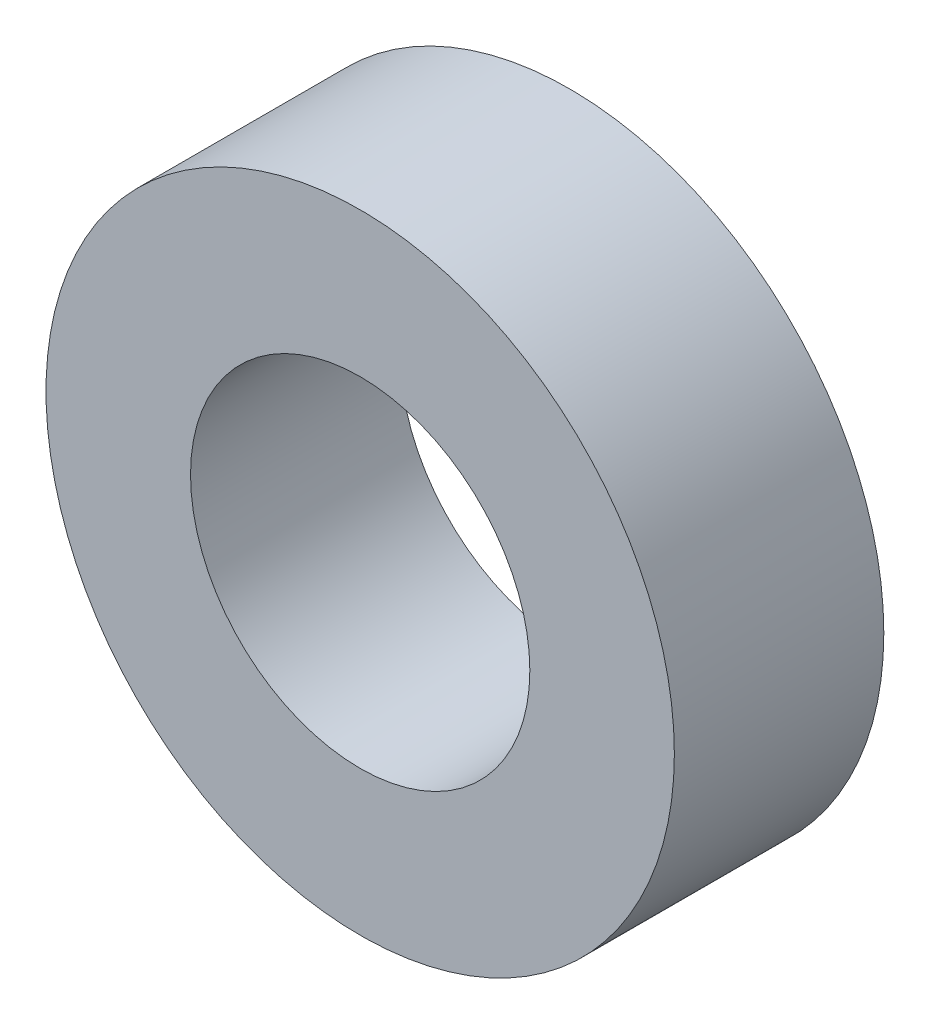
ISO-10303-21;
HEADER;
FILE_DESCRIPTION(('STEP AP214'),'2;1');
FILE_NAME('part.step','',(''),(''),'','','');
FILE_SCHEMA(('AUTOMOTIVE_DESIGN { 1 0 10303 214 1 1 1 1 }'));
ENDSEC;
DATA;
#1=APPLICATION_CONTEXT('core data for automotive mechanical design processes');
#2=APPLICATION_PROTOCOL_DEFINITION('international standard','automotive_design',2000,#1);
#3=PRODUCT_CONTEXT('',#1,'mechanical');
#4=PRODUCT('Part','Part','',(#3));
#5=PRODUCT_RELATED_PRODUCT_CATEGORY('part','',(#4));
#6=PRODUCT_DEFINITION_FORMATION('','',#4);
#7=PRODUCT_DEFINITION_CONTEXT('part definition',#1,'design');
#8=PRODUCT_DEFINITION('design','',#6,#7);
#9=PRODUCT_DEFINITION_SHAPE('','',#8);
#10=(LENGTH_UNIT() NAMED_UNIT(*) SI_UNIT(.MILLI.,.METRE.));
#11=(NAMED_UNIT(*) PLANE_ANGLE_UNIT() SI_UNIT($,.RADIAN.));
#12=(NAMED_UNIT(*) SI_UNIT($,.STERADIAN.) SOLID_ANGLE_UNIT());
#13=UNCERTAINTY_MEASURE_WITH_UNIT(LENGTH_MEASURE(1.E-05),#10,'distance_accuracy_value','');
#14=(GEOMETRIC_REPRESENTATION_CONTEXT(3) GLOBAL_UNCERTAINTY_ASSIGNED_CONTEXT((#13)) GLOBAL_UNIT_ASSIGNED_CONTEXT((#10,
#11,#12)) REPRESENTATION_CONTEXT('',''));
#15=CARTESIAN_POINT('',(0.,0.,0.));
#16=DIRECTION('',(0.,0.,1.));
#17=DIRECTION('',(1.,0.,0.));
#18=AXIS2_PLACEMENT_3D('',#15,#16,#17);
#19=CARTESIAN_POINT('',(0.,0.,5.));
#20=DIRECTION('',(0.,0.,1.));
#21=DIRECTION('',(1.,0.,0.));
#22=AXIS2_PLACEMENT_3D('',#19,#20,#21);
#23=PLANE('',#22);
#24=CARTESIAN_POINT('',(0.,0.,5.));
#25=DIRECTION('',(0.,0.,1.));
#26=DIRECTION('',(1.,0.,0.));
#27=AXIS2_PLACEMENT_3D('',#24,#25,#26);
#28=CIRCLE('',#27,7.5);
#29=CARTESIAN_POINT('',(7.5,0.,5.));
#30=VERTEX_POINT('',#29);
#31=EDGE_CURVE('E10',#30,#30,#28,.T.);
#32=ORIENTED_EDGE('',*,*,#31,.T.);
#33=EDGE_LOOP('',(#32));
#34=FACE_BOUND('',#33,.T.);
#35=CARTESIAN_POINT('',(0.,0.,5.));
#36=DIRECTION('',(0.,0.,1.));
#37=DIRECTION('',(1.,0.,0.));
#38=AXIS2_PLACEMENT_3D('',#35,#36,#37);
#39=CIRCLE('',#38,4.05);
#40=CARTESIAN_POINT('',(4.05,0.,5.));
#41=VERTEX_POINT('',#40);
#42=EDGE_CURVE('E41',#41,#41,#39,.T.);
#43=ORIENTED_EDGE('',*,*,#42,.F.);
#44=EDGE_LOOP('',(#43));
#45=FACE_BOUND('',#44,.T.);
#46=ADVANCED_FACE('F30',(#34,#45),#23,.T.);
#47=CARTESIAN_POINT('',(0.,0.,0.));
#48=DIRECTION('',(0.,0.,1.));
#49=DIRECTION('',(1.,0.,0.));
#50=AXIS2_PLACEMENT_3D('',#47,#48,#49);
#51=PLANE('',#50);
#52=CARTESIAN_POINT('',(0.,0.,0.));
#53=DIRECTION('',(0.,0.,1.));
#54=DIRECTION('',(1.,0.,0.));
#55=AXIS2_PLACEMENT_3D('',#52,#53,#54);
#56=CIRCLE('',#55,7.5);
#57=CARTESIAN_POINT('',(7.5,0.,0.));
#58=VERTEX_POINT('',#57);
#59=EDGE_CURVE('E34',#58,#58,#56,.T.);
#60=ORIENTED_EDGE('',*,*,#59,.F.);
#61=EDGE_LOOP('',(#60));
#62=FACE_BOUND('',#61,.T.);
#63=CARTESIAN_POINT('',(0.,0.,0.));
#64=DIRECTION('',(0.,0.,1.));
#65=DIRECTION('',(1.,0.,0.));
#66=AXIS2_PLACEMENT_3D('',#63,#64,#65);
#67=CIRCLE('',#66,4.05);
#68=CARTESIAN_POINT('',(4.05,0.,0.));
#69=VERTEX_POINT('',#68);
#70=EDGE_CURVE('E43',#69,#69,#67,.T.);
#71=ORIENTED_EDGE('',*,*,#70,.T.);
#72=EDGE_LOOP('',(#71));
#73=FACE_BOUND('',#72,.T.);
#74=ADVANCED_FACE('F53',(#62,#73),#51,.F.);
#75=CARTESIAN_POINT('',(0.,0.,5.));
#76=DIRECTION('',(0.,0.,-1.));
#77=DIRECTION('',(-1.,0.,0.));
#78=AXIS2_PLACEMENT_3D('',#75,#76,#77);
#79=CYLINDRICAL_SURFACE('',#78,7.5);
#80=ORIENTED_EDGE('',*,*,#31,.F.);
#81=EDGE_LOOP('',(#80));
#82=FACE_BOUND('',#81,.T.);
#83=ORIENTED_EDGE('',*,*,#59,.T.);
#84=EDGE_LOOP('',(#83));
#85=FACE_BOUND('',#84,.T.);
#86=ADVANCED_FACE('F32',(#82,#85),#79,.T.);
#87=CARTESIAN_POINT('',(0.,0.,5.));
#88=DIRECTION('',(0.,0.,-1.));
#89=DIRECTION('',(-1.,0.,0.));
#90=AXIS2_PLACEMENT_3D('',#87,#88,#89);
#91=CYLINDRICAL_SURFACE('',#90,4.05);
#92=ORIENTED_EDGE('',*,*,#42,.T.);
#93=EDGE_LOOP('',(#92));
#94=FACE_BOUND('',#93,.T.);
#95=ORIENTED_EDGE('',*,*,#70,.F.);
#96=EDGE_LOOP('',(#95));
#97=FACE_BOUND('',#96,.T.);
#98=ADVANCED_FACE('F49',(#94,#97),#91,.F.);
#99=CLOSED_SHELL('',(#46,#74,#86,#98));
#100=MANIFOLD_SOLID_BREP('B2',#99);
#101=ADVANCED_BREP_SHAPE_REPRESENTATION('',(#18,#100),#14);
#102=SHAPE_DEFINITION_REPRESENTATION(#9,#101);
ENDSEC;
END-ISO-10303-21;
